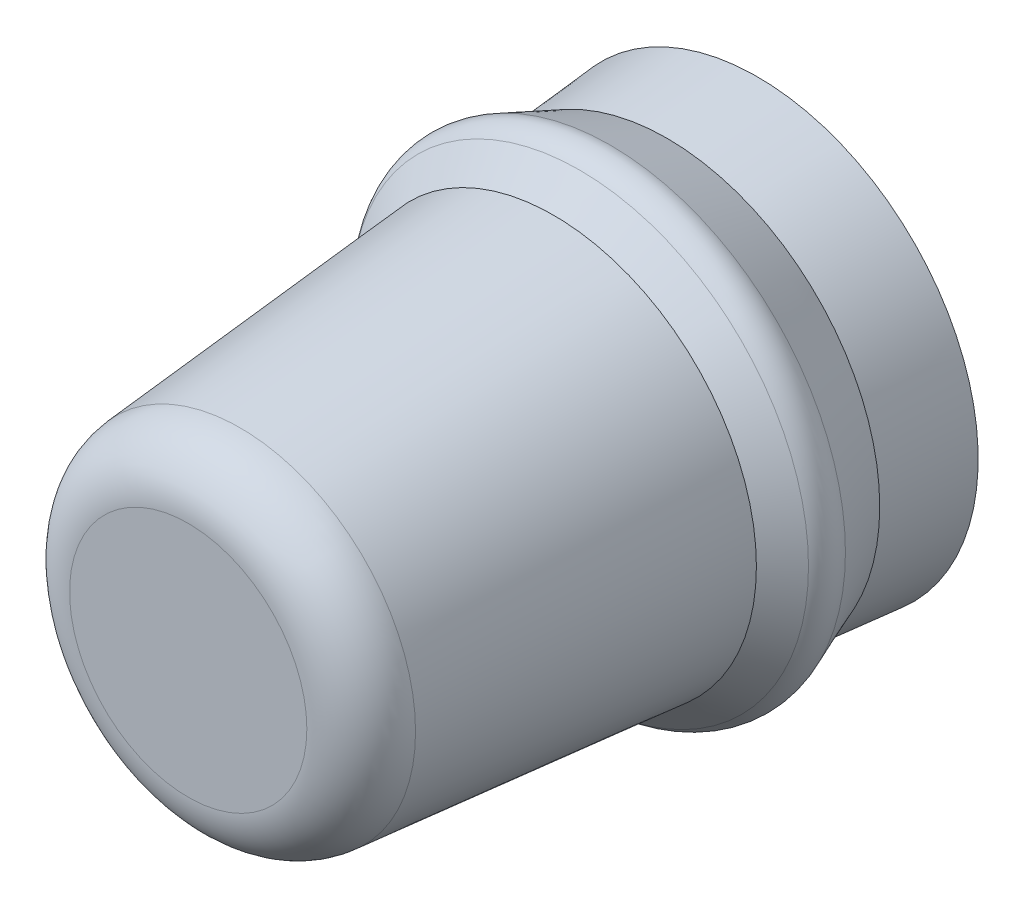
ISO-10303-21;
HEADER;
FILE_DESCRIPTION(('STEP AP214'),'2;1');
FILE_NAME('part.step','',(''),(''),'','','');
FILE_SCHEMA(('AUTOMOTIVE_DESIGN { 1 0 10303 214 1 1 1 1 }'));
ENDSEC;
DATA;
#1=APPLICATION_CONTEXT('core data for automotive mechanical design processes');
#2=APPLICATION_PROTOCOL_DEFINITION('international standard','automotive_design',2000,#1);
#3=PRODUCT_CONTEXT('',#1,'mechanical');
#4=PRODUCT('Part','Part','',(#3));
#5=PRODUCT_RELATED_PRODUCT_CATEGORY('part','',(#4));
#6=PRODUCT_DEFINITION_FORMATION('','',#4);
#7=PRODUCT_DEFINITION_CONTEXT('part definition',#1,'design');
#8=PRODUCT_DEFINITION('design','',#6,#7);
#9=PRODUCT_DEFINITION_SHAPE('','',#8);
#10=(LENGTH_UNIT() NAMED_UNIT(*) SI_UNIT(.MILLI.,.METRE.));
#11=(NAMED_UNIT(*) PLANE_ANGLE_UNIT() SI_UNIT($,.RADIAN.));
#12=(NAMED_UNIT(*) SI_UNIT($,.STERADIAN.) SOLID_ANGLE_UNIT());
#13=UNCERTAINTY_MEASURE_WITH_UNIT(LENGTH_MEASURE(1.E-05),#10,'distance_accuracy_value','');
#14=(GEOMETRIC_REPRESENTATION_CONTEXT(3) GLOBAL_UNCERTAINTY_ASSIGNED_CONTEXT((#13)) GLOBAL_UNIT_ASSIGNED_CONTEXT((#10,
#11,#12)) REPRESENTATION_CONTEXT('',''));
#15=CARTESIAN_POINT('',(0.,0.,0.));
#16=DIRECTION('',(0.,0.,1.));
#17=DIRECTION('',(1.,0.,0.));
#18=AXIS2_PLACEMENT_3D('',#15,#16,#17);
#19=CARTESIAN_POINT('',(0.,0.,-0.715026151381342));
#20=DIRECTION('',(0.,0.,-1.));
#21=DIRECTION('',(-1.,0.,0.));
#22=AXIS2_PLACEMENT_3D('',#19,#20,#21);
#23=CONICAL_SURFACE('',#22,2.,0.0872664625997133);
#24=CARTESIAN_POINT('',(0.,0.,1.79098018631505));
#25=DIRECTION('',(0.,0.,-1.));
#26=DIRECTION('',(-1.,0.,0.));
#27=AXIS2_PLACEMENT_3D('',#24,#25,#26);
#28=CIRCLE('',#27,1.78075285472746);
#29=CARTESIAN_POINT('',(-1.78075285472746,0.,1.79098018631505));
#30=VERTEX_POINT('',#29);
#31=EDGE_CURVE('E57',#30,#30,#28,.T.);
#32=ORIENTED_EDGE('',*,*,#31,.F.);
#33=EDGE_LOOP('',(#32));
#34=FACE_BOUND('',#33,.T.);
#35=CARTESIAN_POINT('',(0.,0.,4.54357787137383));
#36=DIRECTION('',(0.,0.,1.));
#37=DIRECTION('',(1.,0.,0.));
#38=AXIS2_PLACEMENT_3D('',#35,#36,#37);
#39=CIRCLE('',#38,1.53993176203712);
#40=CARTESIAN_POINT('',(1.53993176203712,0.,4.54357787137383));
#41=VERTEX_POINT('',#40);
#42=EDGE_CURVE('E68',#41,#41,#39,.F.);
#43=ORIENTED_EDGE('',*,*,#42,.T.);
#44=EDGE_LOOP('',(#43));
#45=FACE_BOUND('',#44,.T.);
#46=ADVANCED_FACE('F44',(#34,#45),#23,.T.);
#47=CARTESIAN_POINT('',(0.,0.,5.));
#48=DIRECTION('',(0.,0.,1.));
#49=DIRECTION('',(1.,0.,0.));
#50=AXIS2_PLACEMENT_3D('',#47,#48,#49);
#51=PLANE('',#50);
#52=CARTESIAN_POINT('',(0.,0.,5.));
#53=DIRECTION('',(0.,0.,1.));
#54=DIRECTION('',(1.,0.,0.));
#55=AXIS2_PLACEMENT_3D('',#52,#53,#54);
#56=CIRCLE('',#55,1.04183441299125);
#57=CARTESIAN_POINT('',(1.04183441299125,0.,5.));
#58=VERTEX_POINT('',#57);
#59=EDGE_CURVE('E72',#58,#58,#56,.T.);
#60=ORIENTED_EDGE('',*,*,#59,.T.);
#61=EDGE_LOOP('',(#60));
#62=FACE_BOUND('',#61,.T.);
#63=ADVANCED_FACE('F99',(#62),#51,.T.);
#64=CARTESIAN_POINT('',(0.,0.,4.5));
#65=DIRECTION('',(0.,0.,1.));
#66=DIRECTION('',(1.,0.,0.));
#67=AXIS2_PLACEMENT_3D('',#64,#65,#66);
#68=TOROIDAL_SURFACE('',#67,1.04183441299125,0.5);
#69=ORIENTED_EDGE('',*,*,#42,.F.);
#70=EDGE_LOOP('',(#69));
#71=FACE_BOUND('',#70,.T.);
#72=ORIENTED_EDGE('',*,*,#59,.F.);
#73=EDGE_LOOP('',(#72));
#74=FACE_BOUND('',#73,.T.);
#75=ADVANCED_FACE('F105',(#71,#74),#68,.T.);
#76=CARTESIAN_POINT('',(0.,0.,1.4461291763082));
#77=DIRECTION('',(0.,0.,-1.));
#78=DIRECTION('',(-1.,0.,0.));
#79=AXIS2_PLACEMENT_3D('',#76,#77,#78);
#80=CONICAL_SURFACE('',#79,2.1256038647343,0.785398163397454);
#81=CARTESIAN_POINT('',(0.,0.,1.56223948794683));
#82=DIRECTION('',(0.,0.,1.));
#83=DIRECTION('',(1.,0.,0.));
#84=AXIS2_PLACEMENT_3D('',#81,#82,#83);
#85=CIRCLE('',#84,2.00949355309568);
#86=CARTESIAN_POINT('',(2.00949355309568,0.,1.56223948794683));
#87=VERTEX_POINT('',#86);
#88=EDGE_CURVE('E10',#87,#87,#85,.T.);
#89=ORIENTED_EDGE('',*,*,#88,.T.);
#90=EDGE_LOOP('',(#89));
#91=FACE_BOUND('',#90,.T.);
#92=ORIENTED_EDGE('',*,*,#31,.T.);
#93=EDGE_LOOP('',(#92));
#94=FACE_BOUND('',#93,.T.);
#95=ADVANCED_FACE('F112',(#91,#94),#80,.T.);
#96=CARTESIAN_POINT('',(0.,0.,0.795051912053303));
#97=DIRECTION('',(0.,0.,1.));
#98=DIRECTION('',(1.,0.,0.));
#99=AXIS2_PLACEMENT_3D('',#96,#97,#98);
#100=CONICAL_SURFACE('',#99,1.86788528841029,0.376909924371316);
#101=CARTESIAN_POINT('',(0.,0.,1.29345052786418));
#102=DIRECTION('',(0.,0.,-1.));
#103=DIRECTION('',(-1.,0.,0.));
#104=AXIS2_PLACEMENT_3D('',#101,#102,#103);
#105=CIRCLE('',#104,2.06516845088661);
#106=CARTESIAN_POINT('',(-2.06516845088661,0.,1.29345052786418));
#107=VERTEX_POINT('',#106);
#108=EDGE_CURVE('E52',#107,#107,#105,.T.);
#109=ORIENTED_EDGE('',*,*,#108,.T.);
#110=EDGE_LOOP('',(#109));
#111=FACE_BOUND('',#110,.T.);
#112=CARTESIAN_POINT('',(0.,0.,0.795051912053306));
#113=DIRECTION('',(0.,0.,1.));
#114=DIRECTION('',(1.,0.,0.));
#115=AXIS2_PLACEMENT_3D('',#112,#113,#114);
#116=CIRCLE('',#115,1.86788528841029);
#117=CARTESIAN_POINT('',(1.86788528841029,0.,0.795051912053306));
#118=VERTEX_POINT('',#117);
#119=EDGE_CURVE('E62',#118,#118,#116,.T.);
#120=ORIENTED_EDGE('',*,*,#119,.T.);
#121=EDGE_LOOP('',(#120));
#122=FACE_BOUND('',#121,.T.);
#123=ADVANCED_FACE('F94',(#111,#122),#100,.T.);
#124=CARTESIAN_POINT('',(0.,0.,0.));
#125=DIRECTION('',(0.,0.,-1.));
#126=DIRECTION('',(-1.,0.,0.));
#127=AXIS2_PLACEMENT_3D('',#124,#125,#126);
#128=PLANE('',#127);
#129=CARTESIAN_POINT('',(0.,0.,0.));
#130=DIRECTION('',(0.,0.,-1.));
#131=DIRECTION('',(-1.,0.,0.));
#132=AXIS2_PLACEMENT_3D('',#129,#130,#131);
#133=CIRCLE('',#132,1.93744331762956);
#134=CARTESIAN_POINT('',(-1.93744331762956,0.,0.));
#135=VERTEX_POINT('',#134);
#136=EDGE_CURVE('E76',#135,#135,#133,.T.);
#137=ORIENTED_EDGE('',*,*,#136,.T.);
#138=EDGE_LOOP('',(#137));
#139=FACE_BOUND('',#138,.T.);
#140=ADVANCED_FACE('F81',(#139),#128,.T.);
#141=ORIENTED_EDGE('',*,*,#119,.F.);
#142=EDGE_LOOP('',(#141));
#143=FACE_BOUND('',#142,.T.);
#144=ORIENTED_EDGE('',*,*,#136,.F.);
#145=EDGE_LOOP('',(#144));
#146=FACE_BOUND('',#145,.T.);
#147=ADVANCED_FACE('F83',(#143,#146),#23,.T.);
#148=CARTESIAN_POINT('',(0.,0.,1.38546279265019));
#149=DIRECTION('',(0.,0.,1.));
#150=DIRECTION('',(1.,0.,0.));
#151=AXIS2_PLACEMENT_3D('',#148,#149,#150);
#152=TOROIDAL_SURFACE('',#151,1.83271685779904,0.25);
#153=ORIENTED_EDGE('',*,*,#88,.F.);
#154=EDGE_LOOP('',(#153));
#155=FACE_BOUND('',#154,.T.);
#156=ORIENTED_EDGE('',*,*,#108,.F.);
#157=EDGE_LOOP('',(#156));
#158=FACE_BOUND('',#157,.T.);
#159=ADVANCED_FACE('F46',(#155,#158),#152,.T.);
#160=CLOSED_SHELL('',(#46,#63,#75,#95,#123,#140,#147,#159));
#161=MANIFOLD_SOLID_BREP('B2',#160);
#162=ADVANCED_BREP_SHAPE_REPRESENTATION('',(#18,#161),#14);
#163=SHAPE_DEFINITION_REPRESENTATION(#9,#162);
ENDSEC;
END-ISO-10303-21;
